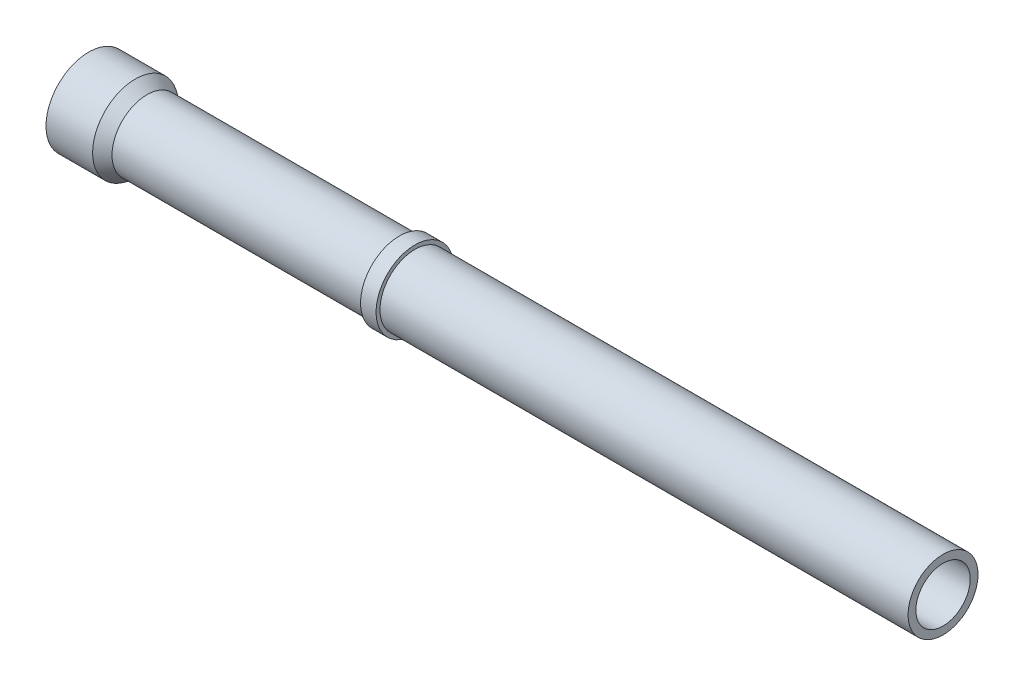
ISO-10303-21;
HEADER;
FILE_DESCRIPTION(('STEP AP214'),'2;1');
FILE_NAME('part.step','',(''),(''),'','','');
FILE_SCHEMA(('AUTOMOTIVE_DESIGN { 1 0 10303 214 1 1 1 1 }'));
ENDSEC;
DATA;
#1=APPLICATION_CONTEXT('core data for automotive mechanical design processes');
#2=APPLICATION_PROTOCOL_DEFINITION('international standard','automotive_design',2000,#1);
#3=PRODUCT_CONTEXT('',#1,'mechanical');
#4=PRODUCT('Part','Part','',(#3));
#5=PRODUCT_RELATED_PRODUCT_CATEGORY('part','',(#4));
#6=PRODUCT_DEFINITION_FORMATION('','',#4);
#7=PRODUCT_DEFINITION_CONTEXT('part definition',#1,'design');
#8=PRODUCT_DEFINITION('design','',#6,#7);
#9=PRODUCT_DEFINITION_SHAPE('','',#8);
#10=(LENGTH_UNIT() NAMED_UNIT(*) SI_UNIT(.MILLI.,.METRE.));
#11=(NAMED_UNIT(*) PLANE_ANGLE_UNIT() SI_UNIT($,.RADIAN.));
#12=(NAMED_UNIT(*) SI_UNIT($,.STERADIAN.) SOLID_ANGLE_UNIT());
#13=UNCERTAINTY_MEASURE_WITH_UNIT(LENGTH_MEASURE(1.E-05),#10,'distance_accuracy_value','');
#14=(GEOMETRIC_REPRESENTATION_CONTEXT(3) GLOBAL_UNCERTAINTY_ASSIGNED_CONTEXT((#13)) GLOBAL_UNIT_ASSIGNED_CONTEXT((#10,
#11,#12)) REPRESENTATION_CONTEXT('',''));
#15=CARTESIAN_POINT('',(0.,0.,0.));
#16=DIRECTION('',(0.,0.,1.));
#17=DIRECTION('',(1.,0.,0.));
#18=AXIS2_PLACEMENT_3D('',#15,#16,#17);
#19=CARTESIAN_POINT('',(349.25,0.,0.));
#20=DIRECTION('',(-1.,0.,0.));
#21=DIRECTION('',(0.,0.,1.));
#22=AXIS2_PLACEMENT_3D('',#19,#20,#21);
#23=CYLINDRICAL_SURFACE('',#22,14.2875);
#24=CARTESIAN_POINT('',(23.8125,0.,0.));
#25=DIRECTION('',(-1.,0.,0.));
#26=DIRECTION('',(0.,0.,1.));
#27=AXIS2_PLACEMENT_3D('',#24,#25,#26);
#28=CIRCLE('',#27,14.2875);
#29=CARTESIAN_POINT('',(23.8125,0.,14.2875));
#30=VERTEX_POINT('',#29);
#31=EDGE_CURVE('E55',#30,#30,#28,.T.);
#32=ORIENTED_EDGE('',*,*,#31,.F.);
#33=EDGE_LOOP('',(#32));
#34=FACE_BOUND('',#33,.T.);
#35=CARTESIAN_POINT('',(127.,0.,0.));
#36=DIRECTION('',(1.,0.,0.));
#37=DIRECTION('',(0.,0.,-1.));
#38=AXIS2_PLACEMENT_3D('',#35,#36,#37);
#39=CIRCLE('',#38,14.2875);
#40=CARTESIAN_POINT('',(127.,0.,-14.2875));
#41=VERTEX_POINT('',#40);
#42=EDGE_CURVE('E10',#41,#41,#39,.T.);
#43=ORIENTED_EDGE('',*,*,#42,.F.);
#44=EDGE_LOOP('',(#43));
#45=FACE_BOUND('',#44,.T.);
#46=ADVANCED_FACE('F31',(#34,#45),#23,.T.);
#47=CARTESIAN_POINT('',(349.25,0.,0.));
#48=DIRECTION('',(1.,0.,0.));
#49=DIRECTION('',(0.,0.,-1.));
#50=AXIS2_PLACEMENT_3D('',#47,#48,#49);
#51=PLANE('',#50);
#52=CARTESIAN_POINT('',(349.25,0.,0.));
#53=DIRECTION('',(1.,0.,0.));
#54=DIRECTION('',(0.,0.,-1.));
#55=AXIS2_PLACEMENT_3D('',#52,#53,#54);
#56=CIRCLE('',#55,14.2875);
#57=CARTESIAN_POINT('',(349.25,0.,-14.2875));
#58=VERTEX_POINT('',#57);
#59=EDGE_CURVE('E39',#58,#58,#56,.T.);
#60=ORIENTED_EDGE('',*,*,#59,.T.);
#61=EDGE_LOOP('',(#60));
#62=FACE_BOUND('',#61,.T.);
#63=CARTESIAN_POINT('',(349.25,0.,0.));
#64=DIRECTION('',(1.,0.,0.));
#65=DIRECTION('',(0.,0.,-1.));
#66=AXIS2_PLACEMENT_3D('',#63,#64,#65);
#67=CIRCLE('',#66,11.1125);
#68=CARTESIAN_POINT('',(349.25,0.,-11.1125));
#69=VERTEX_POINT('',#68);
#70=EDGE_CURVE('E43',#69,#69,#67,.T.);
#71=ORIENTED_EDGE('',*,*,#70,.F.);
#72=EDGE_LOOP('',(#71));
#73=FACE_BOUND('',#72,.T.);
#74=ADVANCED_FACE('F81',(#62,#73),#51,.T.);
#75=CARTESIAN_POINT('',(0.,0.,0.));
#76=DIRECTION('',(1.,0.,0.));
#77=DIRECTION('',(0.,0.,-1.));
#78=AXIS2_PLACEMENT_3D('',#75,#76,#77);
#79=PLANE('',#78);
#80=CARTESIAN_POINT('',(0.,0.,0.));
#81=DIRECTION('',(1.,0.,0.));
#82=DIRECTION('',(0.,0.,-1.));
#83=AXIS2_PLACEMENT_3D('',#80,#81,#82);
#84=CIRCLE('',#83,11.1125);
#85=CARTESIAN_POINT('',(0.,0.,-11.1125));
#86=VERTEX_POINT('',#85);
#87=EDGE_CURVE('E46',#86,#86,#84,.T.);
#88=ORIENTED_EDGE('',*,*,#87,.T.);
#89=EDGE_LOOP('',(#88));
#90=FACE_BOUND('',#89,.T.);
#91=CARTESIAN_POINT('',(0.,0.,0.));
#92=DIRECTION('',(-1.,0.,0.));
#93=DIRECTION('',(0.,0.,1.));
#94=AXIS2_PLACEMENT_3D('',#91,#92,#93);
#95=CIRCLE('',#94,17.4625);
#96=CARTESIAN_POINT('',(0.,0.,17.4625));
#97=VERTEX_POINT('',#96);
#98=EDGE_CURVE('E63',#97,#97,#95,.T.);
#99=ORIENTED_EDGE('',*,*,#98,.T.);
#100=EDGE_LOOP('',(#99));
#101=FACE_BOUND('',#100,.T.);
#102=ADVANCED_FACE('F67',(#90,#101),#79,.F.);
#103=CARTESIAN_POINT('',(133.35,0.,0.));
#104=DIRECTION('',(1.,0.,0.));
#105=DIRECTION('',(0.,0.,-1.));
#106=AXIS2_PLACEMENT_3D('',#103,#104,#105);
#107=CIRCLE('',#106,14.2875);
#108=CARTESIAN_POINT('',(133.35,0.,-14.2875));
#109=VERTEX_POINT('',#108);
#110=EDGE_CURVE('E35',#109,#109,#107,.T.);
#111=ORIENTED_EDGE('',*,*,#110,.T.);
#112=EDGE_LOOP('',(#111));
#113=FACE_BOUND('',#112,.T.);
#114=ORIENTED_EDGE('',*,*,#59,.F.);
#115=EDGE_LOOP('',(#114));
#116=FACE_BOUND('',#115,.T.);
#117=ADVANCED_FACE('F33',(#113,#116),#23,.T.);
#118=CARTESIAN_POINT('',(349.25,0.,0.));
#119=DIRECTION('',(-1.,0.,0.));
#120=DIRECTION('',(0.,0.,1.));
#121=AXIS2_PLACEMENT_3D('',#118,#119,#120);
#122=CYLINDRICAL_SURFACE('',#121,11.1125);
#123=ORIENTED_EDGE('',*,*,#70,.T.);
#124=EDGE_LOOP('',(#123));
#125=FACE_BOUND('',#124,.T.);
#126=ORIENTED_EDGE('',*,*,#87,.F.);
#127=EDGE_LOOP('',(#126));
#128=FACE_BOUND('',#127,.T.);
#129=ADVANCED_FACE('F93',(#125,#128),#122,.F.);
#130=CARTESIAN_POINT('',(133.35,0.,0.));
#131=DIRECTION('',(1.,0.,0.));
#132=DIRECTION('',(0.,0.,-1.));
#133=AXIS2_PLACEMENT_3D('',#130,#131,#132);
#134=PLANE('',#133);
#135=CARTESIAN_POINT('',(133.35,0.,0.));
#136=DIRECTION('',(1.,0.,0.));
#137=DIRECTION('',(0.,0.,-1.));
#138=AXIS2_PLACEMENT_3D('',#135,#136,#137);
#139=CIRCLE('',#138,15.875);
#140=CARTESIAN_POINT('',(133.35,0.,-15.875));
#141=VERTEX_POINT('',#140);
#142=EDGE_CURVE('E54',#141,#141,#139,.T.);
#143=ORIENTED_EDGE('',*,*,#142,.T.);
#144=EDGE_LOOP('',(#143));
#145=FACE_BOUND('',#144,.T.);
#146=ORIENTED_EDGE('',*,*,#110,.F.);
#147=EDGE_LOOP('',(#146));
#148=FACE_BOUND('',#147,.T.);
#149=ADVANCED_FACE('F98',(#145,#148),#134,.T.);
#150=CARTESIAN_POINT('',(127.,0.,0.));
#151=DIRECTION('',(1.,0.,0.));
#152=DIRECTION('',(0.,0.,-1.));
#153=AXIS2_PLACEMENT_3D('',#150,#151,#152);
#154=PLANE('',#153);
#155=CARTESIAN_POINT('',(127.,0.,0.));
#156=DIRECTION('',(1.,0.,0.));
#157=DIRECTION('',(0.,0.,-1.));
#158=AXIS2_PLACEMENT_3D('',#155,#156,#157);
#159=CIRCLE('',#158,15.875);
#160=CARTESIAN_POINT('',(127.,0.,-15.875));
#161=VERTEX_POINT('',#160);
#162=EDGE_CURVE('E51',#161,#161,#159,.T.);
#163=ORIENTED_EDGE('',*,*,#162,.F.);
#164=EDGE_LOOP('',(#163));
#165=FACE_BOUND('',#164,.T.);
#166=ORIENTED_EDGE('',*,*,#42,.T.);
#167=EDGE_LOOP('',(#166));
#168=FACE_BOUND('',#167,.T.);
#169=ADVANCED_FACE('F113',(#165,#168),#154,.F.);
#170=CARTESIAN_POINT('',(133.35,0.,0.));
#171=DIRECTION('',(-1.,0.,0.));
#172=DIRECTION('',(0.,0.,1.));
#173=AXIS2_PLACEMENT_3D('',#170,#171,#172);
#174=CYLINDRICAL_SURFACE('',#173,15.875);
#175=ORIENTED_EDGE('',*,*,#142,.F.);
#176=EDGE_LOOP('',(#175));
#177=FACE_BOUND('',#176,.T.);
#178=ORIENTED_EDGE('',*,*,#162,.T.);
#179=EDGE_LOOP('',(#178));
#180=FACE_BOUND('',#179,.T.);
#181=ADVANCED_FACE('F77',(#177,#180),#174,.T.);
#182=CARTESIAN_POINT('',(19.05,0.,0.));
#183=DIRECTION('',(-1.,0.,0.));
#184=DIRECTION('',(0.,0.,1.));
#185=AXIS2_PLACEMENT_3D('',#182,#183,#184);
#186=CONICAL_SURFACE('',#185,17.4625,0.588002603547566);
#187=ORIENTED_EDGE('',*,*,#31,.T.);
#188=EDGE_LOOP('',(#187));
#189=FACE_BOUND('',#188,.T.);
#190=CARTESIAN_POINT('',(19.05,0.,0.));
#191=DIRECTION('',(-1.,0.,0.));
#192=DIRECTION('',(0.,0.,1.));
#193=AXIS2_PLACEMENT_3D('',#190,#191,#192);
#194=CIRCLE('',#193,17.4625);
#195=CARTESIAN_POINT('',(19.05,0.,17.4625));
#196=VERTEX_POINT('',#195);
#197=EDGE_CURVE('E60',#196,#196,#194,.T.);
#198=ORIENTED_EDGE('',*,*,#197,.F.);
#199=EDGE_LOOP('',(#198));
#200=FACE_BOUND('',#199,.T.);
#201=ADVANCED_FACE('F71',(#189,#200),#186,.T.);
#202=CARTESIAN_POINT('',(0.,0.,0.));
#203=DIRECTION('',(-1.,0.,0.));
#204=DIRECTION('',(0.,0.,1.));
#205=AXIS2_PLACEMENT_3D('',#202,#203,#204);
#206=CYLINDRICAL_SURFACE('',#205,17.4625);
#207=ORIENTED_EDGE('',*,*,#197,.T.);
#208=EDGE_LOOP('',(#207));
#209=FACE_BOUND('',#208,.T.);
#210=ORIENTED_EDGE('',*,*,#98,.F.);
#211=EDGE_LOOP('',(#210));
#212=FACE_BOUND('',#211,.T.);
#213=ADVANCED_FACE('F69',(#209,#212),#206,.T.);
#214=CLOSED_SHELL('',(#46,#74,#102,#117,#129,#149,#169,#181,#201,#213));
#215=MANIFOLD_SOLID_BREP('B2',#214);
#216=ADVANCED_BREP_SHAPE_REPRESENTATION('',(#18,#215),#14);
#217=SHAPE_DEFINITION_REPRESENTATION(#9,#216);
ENDSEC;
END-ISO-10303-21;
